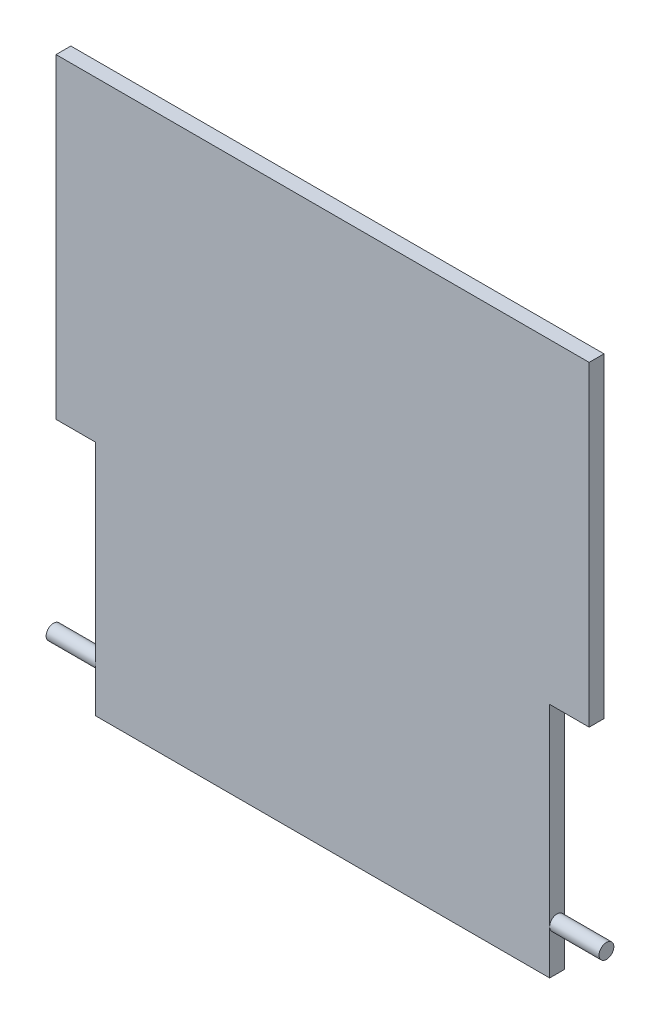
ISO-10303-21;
HEADER;
FILE_DESCRIPTION(('STEP AP214'),'2;1');
FILE_NAME('part.step','',(''),(''),'','','');
FILE_SCHEMA(('AUTOMOTIVE_DESIGN { 1 0 10303 214 1 1 1 1 }'));
ENDSEC;
DATA;
#1=APPLICATION_CONTEXT('core data for automotive mechanical design processes');
#2=APPLICATION_PROTOCOL_DEFINITION('international standard','automotive_design',2000,#1);
#3=PRODUCT_CONTEXT('',#1,'mechanical');
#4=PRODUCT('Part','Part','',(#3));
#5=PRODUCT_RELATED_PRODUCT_CATEGORY('part','',(#4));
#6=PRODUCT_DEFINITION_FORMATION('','',#4);
#7=PRODUCT_DEFINITION_CONTEXT('part definition',#1,'design');
#8=PRODUCT_DEFINITION('design','',#6,#7);
#9=PRODUCT_DEFINITION_SHAPE('','',#8);
#10=(LENGTH_UNIT() NAMED_UNIT(*) SI_UNIT(.MILLI.,.METRE.));
#11=(NAMED_UNIT(*) PLANE_ANGLE_UNIT() SI_UNIT($,.RADIAN.));
#12=(NAMED_UNIT(*) SI_UNIT($,.STERADIAN.) SOLID_ANGLE_UNIT());
#13=UNCERTAINTY_MEASURE_WITH_UNIT(LENGTH_MEASURE(1.E-05),#10,'distance_accuracy_value','');
#14=(GEOMETRIC_REPRESENTATION_CONTEXT(3) GLOBAL_UNCERTAINTY_ASSIGNED_CONTEXT((#13)) GLOBAL_UNIT_ASSIGNED_CONTEXT((#10,
#11,#12)) REPRESENTATION_CONTEXT('',''));
#15=CARTESIAN_POINT('',(0.,0.,0.));
#16=DIRECTION('',(0.,0.,1.));
#17=DIRECTION('',(1.,0.,0.));
#18=AXIS2_PLACEMENT_3D('',#15,#16,#17);
#19=CARTESIAN_POINT('',(-18.25625,19.05,0.595312500000005));
#20=DIRECTION('',(1.,0.,0.));
#21=DIRECTION('',(0.,0.,-1.));
#22=AXIS2_PLACEMENT_3D('',#19,#20,#21);
#23=PLANE('',#22);
#24=CARTESIAN_POINT('',(-18.25625,3.57187500000001,0.));
#25=DIRECTION('',(1.,0.,0.));
#26=DIRECTION('',(0.,0.,-1.));
#27=AXIS2_PLACEMENT_3D('',#24,#25,#26);
#28=CIRCLE('',#27,0.595312500000001);
#29=CARTESIAN_POINT('',(-18.25625,3.57187500000001,-0.595312500000003));
#30=VERTEX_POINT('',#29);
#31=CARTESIAN_POINT('',(-18.25625,3.57187500000001,0.595312500000005));
#32=VERTEX_POINT('',#31);
#33=EDGE_CURVE('E131',#30,#32,#28,.F.);
#34=ORIENTED_EDGE('',*,*,#33,.F.);
#35=DIRECTION('',(0.,-1.,0.));
#36=VECTOR('',#35,1.);
#37=CARTESIAN_POINT('',(-18.25625,19.05,-0.595312500000005));
#38=LINE('',#37,#36);
#39=CARTESIAN_POINT('',(-18.25625,0.,-0.595312500000005));
#40=VERTEX_POINT('',#39);
#41=EDGE_CURVE('E120',#30,#40,#38,.T.);
#42=ORIENTED_EDGE('',*,*,#41,.T.);
#43=DIRECTION('',(0.,0.,-1.));
#44=VECTOR('',#43,1.);
#45=CARTESIAN_POINT('',(-18.25625,0.,0.595312500000005));
#46=LINE('',#45,#44);
#47=CARTESIAN_POINT('',(-18.25625,0.,0.595312500000005));
#48=VERTEX_POINT('',#47);
#49=EDGE_CURVE('E45',#48,#40,#46,.T.);
#50=ORIENTED_EDGE('',*,*,#49,.F.);
#51=DIRECTION('',(0.,-1.,0.));
#52=VECTOR('',#51,1.);
#53=CARTESIAN_POINT('',(-18.25625,19.05,0.595312500000005));
#54=LINE('',#53,#52);
#55=EDGE_CURVE('E132',#32,#48,#54,.T.);
#56=ORIENTED_EDGE('',*,*,#55,.F.);
#57=EDGE_LOOP('',(#34,#42,#50,#56));
#58=FACE_BOUND('',#57,.T.);
#59=ADVANCED_FACE('F37',(#58),#23,.F.);
#60=CARTESIAN_POINT('',(18.25625,0.,0.595312500000005));
#61=DIRECTION('',(-1.,0.,0.));
#62=DIRECTION('',(0.,0.,1.));
#63=AXIS2_PLACEMENT_3D('',#60,#61,#62);
#64=PLANE('',#63);
#65=CARTESIAN_POINT('',(18.25625,3.57187500000001,0.));
#66=DIRECTION('',(-1.,0.,0.));
#67=DIRECTION('',(0.,0.,1.));
#68=AXIS2_PLACEMENT_3D('',#65,#66,#67);
#69=CIRCLE('',#68,0.595312500000001);
#70=CARTESIAN_POINT('',(18.25625,3.57187500000001,0.595312500000005));
#71=VERTEX_POINT('',#70);
#72=CARTESIAN_POINT('',(18.25625,3.57187500000001,-0.595312500000005));
#73=VERTEX_POINT('',#72);
#74=EDGE_CURVE('E137',#71,#73,#69,.F.);
#75=ORIENTED_EDGE('',*,*,#74,.F.);
#76=DIRECTION('',(0.,1.,0.));
#77=VECTOR('',#76,1.);
#78=CARTESIAN_POINT('',(18.25625,0.,0.595312500000005));
#79=LINE('',#78,#77);
#80=CARTESIAN_POINT('',(18.25625,0.,0.595312500000005));
#81=VERTEX_POINT('',#80);
#82=EDGE_CURVE('E151',#81,#71,#79,.T.);
#83=ORIENTED_EDGE('',*,*,#82,.F.);
#84=DIRECTION('',(0.,0.,-1.));
#85=VECTOR('',#84,1.);
#86=CARTESIAN_POINT('',(18.25625,0.,0.595312500000005));
#87=LINE('',#86,#85);
#88=CARTESIAN_POINT('',(18.25625,0.,-0.595312500000005));
#89=VERTEX_POINT('',#88);
#90=EDGE_CURVE('E189',#81,#89,#87,.T.);
#91=ORIENTED_EDGE('',*,*,#90,.T.);
#92=DIRECTION('',(0.,1.,0.));
#93=VECTOR('',#92,1.);
#94=CARTESIAN_POINT('',(18.25625,0.,-0.595312500000005));
#95=LINE('',#94,#93);
#96=EDGE_CURVE('E165',#89,#73,#95,.T.);
#97=ORIENTED_EDGE('',*,*,#96,.T.);
#98=EDGE_LOOP('',(#75,#83,#91,#97));
#99=FACE_BOUND('',#98,.T.);
#100=ADVANCED_FACE('F224',(#99),#64,.F.);
#101=CARTESIAN_POINT('',(-21.43125,19.05,0.595312500000005));
#102=DIRECTION('',(0.,1.,0.));
#103=DIRECTION('',(-1.,0.,0.));
#104=AXIS2_PLACEMENT_3D('',#101,#102,#103);
#105=PLANE('',#104);
#106=DIRECTION('',(1.,0.,0.));
#107=VECTOR('',#106,1.);
#108=CARTESIAN_POINT('',(-21.43125,19.05,-0.595312500000005));
#109=LINE('',#108,#107);
#110=CARTESIAN_POINT('',(-21.43125,19.05,-0.595312500000005));
#111=VERTEX_POINT('',#110);
#112=CARTESIAN_POINT('',(-18.25625,19.05,-0.595312500000005));
#113=VERTEX_POINT('',#112);
#114=EDGE_CURVE('E129',#111,#113,#109,.T.);
#115=ORIENTED_EDGE('',*,*,#114,.T.);
#116=DIRECTION('',(0.,0.,-1.));
#117=VECTOR('',#116,1.);
#118=CARTESIAN_POINT('',(-18.25625,19.05,0.595312500000005));
#119=LINE('',#118,#117);
#120=CARTESIAN_POINT('',(-18.25625,19.05,0.595312500000005));
#121=VERTEX_POINT('',#120);
#122=EDGE_CURVE('E11',#121,#113,#119,.T.);
#123=ORIENTED_EDGE('',*,*,#122,.F.);
#124=DIRECTION('',(1.,0.,0.));
#125=VECTOR('',#124,1.);
#126=CARTESIAN_POINT('',(-21.43125,19.05,0.595312500000005));
#127=LINE('',#126,#125);
#128=CARTESIAN_POINT('',(-21.43125,19.05,0.595312500000005));
#129=VERTEX_POINT('',#128);
#130=EDGE_CURVE('E142',#129,#121,#127,.T.);
#131=ORIENTED_EDGE('',*,*,#130,.F.);
#132=DIRECTION('',(0.,0.,-1.));
#133=VECTOR('',#132,1.);
#134=CARTESIAN_POINT('',(-21.43125,19.05,0.595312500000005));
#135=LINE('',#134,#133);
#136=EDGE_CURVE('E161',#129,#111,#135,.T.);
#137=ORIENTED_EDGE('',*,*,#136,.T.);
#138=EDGE_LOOP('',(#115,#123,#131,#137));
#139=FACE_BOUND('',#138,.T.);
#140=ADVANCED_FACE('F39',(#139),#105,.F.);
#141=EDGE_CURVE('E52',#32,#30,#28,.F.);
#142=ORIENTED_EDGE('',*,*,#141,.F.);
#143=EDGE_CURVE('E146',#121,#32,#54,.T.);
#144=ORIENTED_EDGE('',*,*,#143,.F.);
#145=ORIENTED_EDGE('',*,*,#122,.T.);
#146=EDGE_CURVE('E112',#113,#30,#38,.T.);
#147=ORIENTED_EDGE('',*,*,#146,.T.);
#148=EDGE_LOOP('',(#142,#144,#145,#147));
#149=FACE_BOUND('',#148,.T.);
#150=ADVANCED_FACE('F114',(#149),#23,.F.);
#151=CARTESIAN_POINT('',(-18.25625,0.,0.595312500000005));
#152=DIRECTION('',(0.,1.,0.));
#153=DIRECTION('',(-1.,0.,0.));
#154=AXIS2_PLACEMENT_3D('',#151,#152,#153);
#155=PLANE('',#154);
#156=DIRECTION('',(1.,0.,0.));
#157=VECTOR('',#156,1.);
#158=CARTESIAN_POINT('',(-18.25625,0.,-0.595312500000005));
#159=LINE('',#158,#157);
#160=EDGE_CURVE('E119',#40,#89,#159,.T.);
#161=ORIENTED_EDGE('',*,*,#160,.T.);
#162=ORIENTED_EDGE('',*,*,#90,.F.);
#163=DIRECTION('',(1.,0.,0.));
#164=VECTOR('',#163,1.);
#165=CARTESIAN_POINT('',(-18.25625,0.,0.595312500000005));
#166=LINE('',#165,#164);
#167=EDGE_CURVE('E148',#48,#81,#166,.T.);
#168=ORIENTED_EDGE('',*,*,#167,.F.);
#169=ORIENTED_EDGE('',*,*,#49,.T.);
#170=EDGE_LOOP('',(#161,#162,#168,#169));
#171=FACE_BOUND('',#170,.T.);
#172=ADVANCED_FACE('F193',(#171),#155,.F.);
#173=EDGE_CURVE('E60',#73,#71,#69,.F.);
#174=ORIENTED_EDGE('',*,*,#173,.F.);
#175=CARTESIAN_POINT('',(18.25625,19.05,-0.595312500000005));
#176=VERTEX_POINT('',#175);
#177=EDGE_CURVE('E164',#73,#176,#95,.T.);
#178=ORIENTED_EDGE('',*,*,#177,.T.);
#179=DIRECTION('',(0.,0.,-1.));
#180=VECTOR('',#179,1.);
#181=CARTESIAN_POINT('',(18.25625,19.05,0.595312500000005));
#182=LINE('',#181,#180);
#183=CARTESIAN_POINT('',(18.25625,19.05,0.595312500000005));
#184=VERTEX_POINT('',#183);
#185=EDGE_CURVE('E186',#184,#176,#182,.T.);
#186=ORIENTED_EDGE('',*,*,#185,.F.);
#187=EDGE_CURVE('E150',#71,#184,#79,.T.);
#188=ORIENTED_EDGE('',*,*,#187,.F.);
#189=EDGE_LOOP('',(#174,#178,#186,#188));
#190=FACE_BOUND('',#189,.T.);
#191=ADVANCED_FACE('F221',(#190),#64,.F.);
#192=CARTESIAN_POINT('',(18.25625,19.05,0.595312500000005));
#193=DIRECTION('',(0.,1.,0.));
#194=DIRECTION('',(0.,0.,1.));
#195=AXIS2_PLACEMENT_3D('',#192,#193,#194);
#196=PLANE('',#195);
#197=DIRECTION('',(1.,0.,0.));
#198=VECTOR('',#197,1.);
#199=CARTESIAN_POINT('',(18.25625,19.05,-0.595312500000005));
#200=LINE('',#199,#198);
#201=CARTESIAN_POINT('',(21.43125,19.05,-0.595312500000005));
#202=VERTEX_POINT('',#201);
#203=EDGE_CURVE('E168',#176,#202,#200,.T.);
#204=ORIENTED_EDGE('',*,*,#203,.T.);
#205=DIRECTION('',(0.,0.,-1.));
#206=VECTOR('',#205,1.);
#207=CARTESIAN_POINT('',(21.43125,19.05,0.595312500000005));
#208=LINE('',#207,#206);
#209=CARTESIAN_POINT('',(21.43125,19.05,0.595312500000005));
#210=VERTEX_POINT('',#209);
#211=EDGE_CURVE('E183',#210,#202,#208,.T.);
#212=ORIENTED_EDGE('',*,*,#211,.F.);
#213=DIRECTION('',(1.,0.,0.));
#214=VECTOR('',#213,1.);
#215=CARTESIAN_POINT('',(18.25625,19.05,0.595312500000005));
#216=LINE('',#215,#214);
#217=EDGE_CURVE('E153',#184,#210,#216,.T.);
#218=ORIENTED_EDGE('',*,*,#217,.F.);
#219=ORIENTED_EDGE('',*,*,#185,.T.);
#220=EDGE_LOOP('',(#204,#212,#218,#219));
#221=FACE_BOUND('',#220,.T.);
#222=ADVANCED_FACE('F218',(#221),#196,.F.);
#223=CARTESIAN_POINT('',(21.43125,19.05,0.595312500000005));
#224=DIRECTION('',(-1.,0.,0.));
#225=DIRECTION('',(0.,0.,1.));
#226=AXIS2_PLACEMENT_3D('',#223,#224,#225);
#227=PLANE('',#226);
#228=DIRECTION('',(0.,1.,0.));
#229=VECTOR('',#228,1.);
#230=CARTESIAN_POINT('',(21.43125,19.05,-0.595312500000005));
#231=LINE('',#230,#229);
#232=CARTESIAN_POINT('',(21.43125,44.45,-0.595312500000005));
#233=VERTEX_POINT('',#232);
#234=EDGE_CURVE('E170',#202,#233,#231,.T.);
#235=ORIENTED_EDGE('',*,*,#234,.T.);
#236=DIRECTION('',(0.,0.,-1.));
#237=VECTOR('',#236,1.);
#238=CARTESIAN_POINT('',(21.43125,44.45,0.595312500000005));
#239=LINE('',#238,#237);
#240=CARTESIAN_POINT('',(21.43125,44.45,0.595312500000005));
#241=VERTEX_POINT('',#240);
#242=EDGE_CURVE('E180',#241,#233,#239,.T.);
#243=ORIENTED_EDGE('',*,*,#242,.F.);
#244=DIRECTION('',(0.,1.,0.));
#245=VECTOR('',#244,1.);
#246=CARTESIAN_POINT('',(21.43125,19.05,0.595312500000005));
#247=LINE('',#246,#245);
#248=EDGE_CURVE('E155',#210,#241,#247,.T.);
#249=ORIENTED_EDGE('',*,*,#248,.F.);
#250=ORIENTED_EDGE('',*,*,#211,.T.);
#251=EDGE_LOOP('',(#235,#243,#249,#250));
#252=FACE_BOUND('',#251,.T.);
#253=ADVANCED_FACE('F214',(#252),#227,.F.);
#254=CARTESIAN_POINT('',(21.43125,44.45,0.595312500000005));
#255=DIRECTION('',(0.,-1.,0.));
#256=DIRECTION('',(0.,0.,-1.));
#257=AXIS2_PLACEMENT_3D('',#254,#255,#256);
#258=PLANE('',#257);
#259=DIRECTION('',(-1.,0.,0.));
#260=VECTOR('',#259,1.);
#261=CARTESIAN_POINT('',(21.43125,44.45,-0.595312500000005));
#262=LINE('',#261,#260);
#263=CARTESIAN_POINT('',(-21.43125,44.45,-0.595312500000005));
#264=VERTEX_POINT('',#263);
#265=EDGE_CURVE('E172',#233,#264,#262,.T.);
#266=ORIENTED_EDGE('',*,*,#265,.T.);
#267=DIRECTION('',(0.,0.,-1.));
#268=VECTOR('',#267,1.);
#269=CARTESIAN_POINT('',(-21.43125,44.45,0.595312500000005));
#270=LINE('',#269,#268);
#271=CARTESIAN_POINT('',(-21.43125,44.45,0.595312500000005));
#272=VERTEX_POINT('',#271);
#273=EDGE_CURVE('E177',#272,#264,#270,.T.);
#274=ORIENTED_EDGE('',*,*,#273,.F.);
#275=DIRECTION('',(-1.,0.,0.));
#276=VECTOR('',#275,1.);
#277=CARTESIAN_POINT('',(21.43125,44.45,0.595312500000005));
#278=LINE('',#277,#276);
#279=EDGE_CURVE('E157',#241,#272,#278,.T.);
#280=ORIENTED_EDGE('',*,*,#279,.F.);
#281=ORIENTED_EDGE('',*,*,#242,.T.);
#282=EDGE_LOOP('',(#266,#274,#280,#281));
#283=FACE_BOUND('',#282,.T.);
#284=ADVANCED_FACE('F210',(#283),#258,.F.);
#285=CARTESIAN_POINT('',(-21.43125,44.45,0.595312500000005));
#286=DIRECTION('',(1.,0.,0.));
#287=DIRECTION('',(0.,1.,0.));
#288=AXIS2_PLACEMENT_3D('',#285,#286,#287);
#289=PLANE('',#288);
#290=DIRECTION('',(0.,-1.,0.));
#291=VECTOR('',#290,1.);
#292=CARTESIAN_POINT('',(-21.43125,44.45,-0.595312500000005));
#293=LINE('',#292,#291);
#294=EDGE_CURVE('E145',#264,#111,#293,.T.);
#295=ORIENTED_EDGE('',*,*,#294,.T.);
#296=ORIENTED_EDGE('',*,*,#136,.F.);
#297=DIRECTION('',(0.,-1.,0.));
#298=VECTOR('',#297,1.);
#299=CARTESIAN_POINT('',(-21.43125,44.45,0.595312500000005));
#300=LINE('',#299,#298);
#301=EDGE_CURVE('E159',#272,#129,#300,.T.);
#302=ORIENTED_EDGE('',*,*,#301,.F.);
#303=ORIENTED_EDGE('',*,*,#273,.T.);
#304=EDGE_LOOP('',(#295,#296,#302,#303));
#305=FACE_BOUND('',#304,.T.);
#306=ADVANCED_FACE('F206',(#305),#289,.F.);
#307=CARTESIAN_POINT('',(0.,0.,0.595312500000005));
#308=DIRECTION('',(0.,0.,-1.));
#309=DIRECTION('',(-1.,0.,0.));
#310=AXIS2_PLACEMENT_3D('',#307,#308,#309);
#311=PLANE('',#310);
#312=ORIENTED_EDGE('',*,*,#143,.T.);
#313=ORIENTED_EDGE('',*,*,#55,.T.);
#314=ORIENTED_EDGE('',*,*,#167,.T.);
#315=ORIENTED_EDGE('',*,*,#82,.T.);
#316=ORIENTED_EDGE('',*,*,#187,.T.);
#317=ORIENTED_EDGE('',*,*,#217,.T.);
#318=ORIENTED_EDGE('',*,*,#248,.T.);
#319=ORIENTED_EDGE('',*,*,#279,.T.);
#320=ORIENTED_EDGE('',*,*,#301,.T.);
#321=ORIENTED_EDGE('',*,*,#130,.T.);
#322=EDGE_LOOP('',(#312,#313,#314,#315,#316,#317,#318,#319,#320,#321));
#323=FACE_BOUND('',#322,.T.);
#324=ADVANCED_FACE('F197',(#323),#311,.F.);
#325=CARTESIAN_POINT('',(0.,0.,-0.595312500000005));
#326=DIRECTION('',(0.,0.,-1.));
#327=DIRECTION('',(-1.,0.,0.));
#328=AXIS2_PLACEMENT_3D('',#325,#326,#327);
#329=PLANE('',#328);
#330=ORIENTED_EDGE('',*,*,#177,.F.);
#331=ORIENTED_EDGE('',*,*,#96,.F.);
#332=ORIENTED_EDGE('',*,*,#160,.F.);
#333=ORIENTED_EDGE('',*,*,#41,.F.);
#334=ORIENTED_EDGE('',*,*,#146,.F.);
#335=ORIENTED_EDGE('',*,*,#114,.F.);
#336=ORIENTED_EDGE('',*,*,#294,.F.);
#337=ORIENTED_EDGE('',*,*,#265,.F.);
#338=ORIENTED_EDGE('',*,*,#234,.F.);
#339=ORIENTED_EDGE('',*,*,#203,.F.);
#340=EDGE_LOOP('',(#330,#331,#332,#333,#334,#335,#336,#337,#338,#339));
#341=FACE_BOUND('',#340,.T.);
#342=ADVANCED_FACE('F124',(#341),#329,.T.);
#343=CARTESIAN_POINT('',(22.225,3.57187500000001,0.));
#344=DIRECTION('',(1.,0.,0.));
#345=DIRECTION('',(0.,0.,-1.));
#346=AXIS2_PLACEMENT_3D('',#343,#344,#345);
#347=PLANE('',#346);
#348=CARTESIAN_POINT('',(22.225,3.57187500000001,0.));
#349=DIRECTION('',(1.,0.,0.));
#350=DIRECTION('',(0.,0.,-1.));
#351=AXIS2_PLACEMENT_3D('',#348,#349,#350);
#352=CIRCLE('',#351,0.595312500000001);
#353=CARTESIAN_POINT('',(22.225,3.57187500000001,-0.595312500000001));
#354=VERTEX_POINT('',#353);
#355=EDGE_CURVE('E227',#354,#354,#352,.T.);
#356=ORIENTED_EDGE('',*,*,#355,.T.);
#357=EDGE_LOOP('',(#356));
#358=FACE_BOUND('',#357,.T.);
#359=ADVANCED_FACE('F303',(#358),#347,.T.);
#360=CARTESIAN_POINT('',(22.225,3.57187500000001,0.));
#361=DIRECTION('',(-1.,0.,0.));
#362=DIRECTION('',(0.,0.,1.));
#363=AXIS2_PLACEMENT_3D('',#360,#361,#362);
#364=CYLINDRICAL_SURFACE('',#363,0.595312500000001);
#365=ORIENTED_EDGE('',*,*,#355,.F.);
#366=EDGE_LOOP('',(#365));
#367=FACE_BOUND('',#366,.T.);
#368=ORIENTED_EDGE('',*,*,#173,.T.);
#369=ORIENTED_EDGE('',*,*,#74,.T.);
#370=EDGE_LOOP('',(#368,#369));
#371=FACE_BOUND('',#370,.T.);
#372=ADVANCED_FACE('F226',(#367,#371),#364,.T.);
#373=CARTESIAN_POINT('',(-22.225,3.57187500000001,0.));
#374=DIRECTION('',(1.,0.,0.));
#375=DIRECTION('',(0.,0.,-1.));
#376=AXIS2_PLACEMENT_3D('',#373,#374,#375);
#377=CIRCLE('',#376,0.595312500000001);
#378=CARTESIAN_POINT('',(-22.225,3.57187500000001,-0.595312500000001));
#379=VERTEX_POINT('',#378);
#380=EDGE_CURVE('E229',#379,#379,#377,.T.);
#381=ORIENTED_EDGE('',*,*,#380,.T.);
#382=EDGE_LOOP('',(#381));
#383=FACE_BOUND('',#382,.T.);
#384=ORIENTED_EDGE('',*,*,#141,.T.);
#385=ORIENTED_EDGE('',*,*,#33,.T.);
#386=EDGE_LOOP('',(#384,#385));
#387=FACE_BOUND('',#386,.T.);
#388=ADVANCED_FACE('F136',(#383,#387),#364,.T.);
#389=CARTESIAN_POINT('',(-22.225,3.57187500000001,0.));
#390=DIRECTION('',(1.,0.,0.));
#391=DIRECTION('',(0.,0.,-1.));
#392=AXIS2_PLACEMENT_3D('',#389,#390,#391);
#393=PLANE('',#392);
#394=ORIENTED_EDGE('',*,*,#380,.F.);
#395=EDGE_LOOP('',(#394));
#396=FACE_BOUND('',#395,.T.);
#397=ADVANCED_FACE('F237',(#396),#393,.F.);
#398=CLOSED_SHELL('',(#59,#100,#140,#150,#172,#191,#222,#253,#284,#306,#324,#342,#359,#372,#388,#397));
#399=MANIFOLD_SOLID_BREP('B2',#398);
#400=ADVANCED_BREP_SHAPE_REPRESENTATION('',(#18,#399),#14);
#401=SHAPE_DEFINITION_REPRESENTATION(#9,#400);
ENDSEC;
END-ISO-10303-21;
